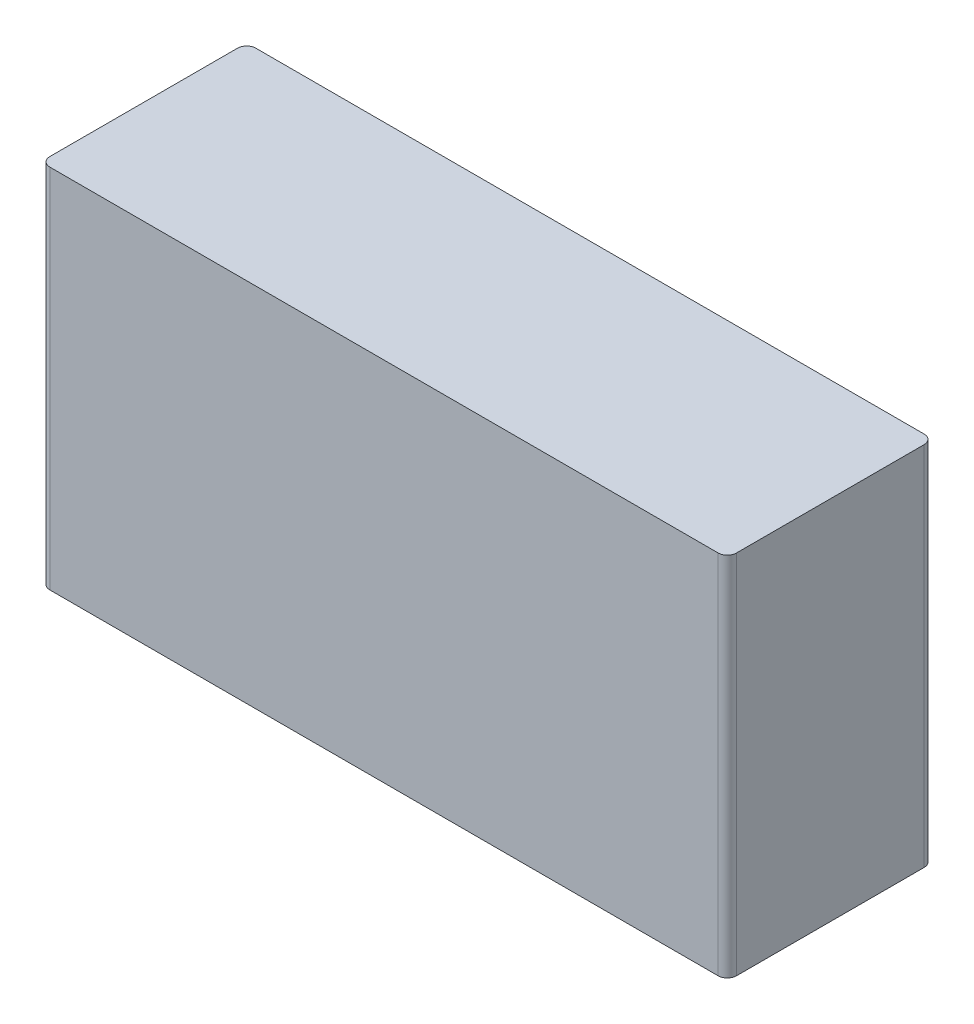
ISO-10303-21;
HEADER;
FILE_DESCRIPTION(('STEP AP214'),'2;1');
FILE_NAME('part.step','',(''),(''),'','','');
FILE_SCHEMA(('AUTOMOTIVE_DESIGN { 1 0 10303 214 1 1 1 1 }'));
ENDSEC;
DATA;
#1=APPLICATION_CONTEXT('core data for automotive mechanical design processes');
#2=APPLICATION_PROTOCOL_DEFINITION('international standard','automotive_design',2000,#1);
#3=PRODUCT_CONTEXT('',#1,'mechanical');
#4=PRODUCT('Part','Part','',(#3));
#5=PRODUCT_RELATED_PRODUCT_CATEGORY('part','',(#4));
#6=PRODUCT_DEFINITION_FORMATION('','',#4);
#7=PRODUCT_DEFINITION_CONTEXT('part definition',#1,'design');
#8=PRODUCT_DEFINITION('design','',#6,#7);
#9=PRODUCT_DEFINITION_SHAPE('','',#8);
#10=(LENGTH_UNIT() NAMED_UNIT(*) SI_UNIT(.MILLI.,.METRE.));
#11=(NAMED_UNIT(*) PLANE_ANGLE_UNIT() SI_UNIT($,.RADIAN.));
#12=(NAMED_UNIT(*) SI_UNIT($,.STERADIAN.) SOLID_ANGLE_UNIT());
#13=UNCERTAINTY_MEASURE_WITH_UNIT(LENGTH_MEASURE(1.E-05),#10,'distance_accuracy_value','');
#14=(GEOMETRIC_REPRESENTATION_CONTEXT(3) GLOBAL_UNCERTAINTY_ASSIGNED_CONTEXT((#13)) GLOBAL_UNIT_ASSIGNED_CONTEXT((#10,
#11,#12)) REPRESENTATION_CONTEXT('',''));
#15=CARTESIAN_POINT('',(0.,0.,0.));
#16=DIRECTION('',(0.,0.,1.));
#17=DIRECTION('',(1.,0.,0.));
#18=AXIS2_PLACEMENT_3D('',#15,#16,#17);
#19=CARTESIAN_POINT('',(0.,0.,0.5));
#20=DIRECTION('',(0.,0.,-1.));
#21=DIRECTION('',(0.,-1.,0.));
#22=AXIS2_PLACEMENT_3D('',#19,#20,#21);
#23=PLANE('',#22);
#24=DIRECTION('',(0.,1.,0.));
#25=VECTOR('',#24,1.);
#26=CARTESIAN_POINT('',(-0.73,0.2,0.5));
#27=LINE('',#26,#25);
#28=CARTESIAN_POINT('',(-0.73,-0.4,0.5));
#29=VERTEX_POINT('',#28);
#30=CARTESIAN_POINT('',(-0.73,0.4,0.5));
#31=VERTEX_POINT('',#30);
#32=EDGE_CURVE('E160',#29,#31,#27,.T.);
#33=ORIENTED_EDGE('',*,*,#32,.F.);
#34=DIRECTION('',(1.,0.,0.));
#35=VECTOR('',#34,1.);
#36=CARTESIAN_POINT('',(-0.775,-0.4,0.5));
#37=LINE('',#36,#35);
#38=CARTESIAN_POINT('',(0.73,-0.4,0.5));
#39=VERTEX_POINT('',#38);
#40=EDGE_CURVE('E11',#29,#39,#37,.T.);
#41=ORIENTED_EDGE('',*,*,#40,.T.);
#42=DIRECTION('',(0.,-1.,0.));
#43=VECTOR('',#42,1.);
#44=CARTESIAN_POINT('',(0.73,0.2,0.5));
#45=LINE('',#44,#43);
#46=CARTESIAN_POINT('',(0.73,0.4,0.5));
#47=VERTEX_POINT('',#46);
#48=EDGE_CURVE('E20',#47,#39,#45,.T.);
#49=ORIENTED_EDGE('',*,*,#48,.F.);
#50=DIRECTION('',(-1.,0.,0.));
#51=VECTOR('',#50,1.);
#52=CARTESIAN_POINT('',(0.025,0.4,0.5));
#53=LINE('',#52,#51);
#54=EDGE_CURVE('E176',#47,#31,#53,.T.);
#55=ORIENTED_EDGE('',*,*,#54,.T.);
#56=EDGE_LOOP('',(#33,#41,#49,#55));
#57=FACE_BOUND('',#56,.T.);
#58=ADVANCED_FACE('F17',(#57),#23,.F.);
#59=CARTESIAN_POINT('',(-0.8,-0.4,0.));
#60=DIRECTION('',(0.,-1.,0.));
#61=DIRECTION('',(0.,0.,-1.));
#62=AXIS2_PLACEMENT_3D('',#59,#60,#61);
#63=PLANE('',#62);
#64=CARTESIAN_POINT('',(-0.73,-0.4,0.48));
#65=DIRECTION('',(0.,1.,0.));
#66=DIRECTION('',(-0.707106781186548,0.,0.707106781186548));
#67=AXIS2_PLACEMENT_3D('',#64,#65,#66);
#68=CIRCLE('',#67,0.02);
#69=CARTESIAN_POINT('',(-0.75,-0.4,0.48));
#70=VERTEX_POINT('',#69);
#71=EDGE_CURVE('E164',#70,#29,#68,.T.);
#72=ORIENTED_EDGE('',*,*,#71,.F.);
#73=DIRECTION('',(0.,0.,1.));
#74=VECTOR('',#73,1.);
#75=CARTESIAN_POINT('',(-0.75,-0.4,0.025));
#76=LINE('',#75,#74);
#77=CARTESIAN_POINT('',(-0.75,-0.4,0.07));
#78=VERTEX_POINT('',#77);
#79=EDGE_CURVE('E179',#78,#70,#76,.T.);
#80=ORIENTED_EDGE('',*,*,#79,.F.);
#81=CARTESIAN_POINT('',(-0.73,-0.4,0.07));
#82=DIRECTION('',(0.,1.,0.));
#83=DIRECTION('',(-0.707106781186548,0.,-0.707106781186548));
#84=AXIS2_PLACEMENT_3D('',#81,#82,#83);
#85=CIRCLE('',#84,0.02);
#86=CARTESIAN_POINT('',(-0.73,-0.4,0.05));
#87=VERTEX_POINT('',#86);
#88=EDGE_CURVE('E108',#87,#78,#85,.T.);
#89=ORIENTED_EDGE('',*,*,#88,.F.);
#90=DIRECTION('',(-1.,0.,0.));
#91=VECTOR('',#90,1.);
#92=CARTESIAN_POINT('',(-0.025,-0.4,0.05));
#93=LINE('',#92,#91);
#94=CARTESIAN_POINT('',(0.73,-0.4,0.05));
#95=VERTEX_POINT('',#94);
#96=EDGE_CURVE('E107',#95,#87,#93,.T.);
#97=ORIENTED_EDGE('',*,*,#96,.F.);
#98=CARTESIAN_POINT('',(0.73,-0.4,0.07));
#99=DIRECTION('',(0.,1.,0.));
#100=DIRECTION('',(0.707106781186548,0.,-0.707106781186548));
#101=AXIS2_PLACEMENT_3D('',#98,#99,#100);
#102=CIRCLE('',#101,0.02);
#103=CARTESIAN_POINT('',(0.75,-0.4,0.07));
#104=VERTEX_POINT('',#103);
#105=EDGE_CURVE('E103',#104,#95,#102,.T.);
#106=ORIENTED_EDGE('',*,*,#105,.F.);
#107=DIRECTION('',(0.,0.,-1.));
#108=VECTOR('',#107,1.);
#109=CARTESIAN_POINT('',(0.75,-0.4,0.25));
#110=LINE('',#109,#108);
#111=CARTESIAN_POINT('',(0.75,-0.4,0.48));
#112=VERTEX_POINT('',#111);
#113=EDGE_CURVE('E157',#112,#104,#110,.T.);
#114=ORIENTED_EDGE('',*,*,#113,.F.);
#115=CARTESIAN_POINT('',(0.73,-0.4,0.48));
#116=DIRECTION('',(0.,1.,0.));
#117=DIRECTION('',(0.707106781186548,0.,0.707106781186548));
#118=AXIS2_PLACEMENT_3D('',#115,#116,#117);
#119=CIRCLE('',#118,0.02);
#120=EDGE_CURVE('E27',#39,#112,#119,.T.);
#121=ORIENTED_EDGE('',*,*,#120,.F.);
#122=ORIENTED_EDGE('',*,*,#40,.F.);
#123=EDGE_LOOP('',(#72,#80,#89,#97,#106,#114,#121,#122));
#124=FACE_BOUND('',#123,.T.);
#125=ADVANCED_FACE('F213',(#124),#63,.T.);
#126=CARTESIAN_POINT('',(0.73,0.2,0.48));
#127=DIRECTION('',(0.,1.,0.));
#128=DIRECTION('',(0.707106781186548,0.,0.707106781186548));
#129=AXIS2_PLACEMENT_3D('',#126,#127,#128);
#130=CYLINDRICAL_SURFACE('',#129,0.02);
#131=CARTESIAN_POINT('',(0.73,0.4,0.48));
#132=DIRECTION('',(0.,-1.,0.));
#133=DIRECTION('',(0.707106781186548,0.,0.707106781186548));
#134=AXIS2_PLACEMENT_3D('',#131,#132,#133);
#135=CIRCLE('',#134,0.02);
#136=CARTESIAN_POINT('',(0.75,0.4,0.48));
#137=VERTEX_POINT('',#136);
#138=EDGE_CURVE('E131',#137,#47,#135,.T.);
#139=ORIENTED_EDGE('',*,*,#138,.T.);
#140=ORIENTED_EDGE('',*,*,#48,.T.);
#141=ORIENTED_EDGE('',*,*,#120,.T.);
#142=DIRECTION('',(0.,1.,0.));
#143=VECTOR('',#142,1.);
#144=CARTESIAN_POINT('',(0.75,0.2,0.48));
#145=LINE('',#144,#143);
#146=EDGE_CURVE('E154',#112,#137,#145,.T.);
#147=ORIENTED_EDGE('',*,*,#146,.T.);
#148=EDGE_LOOP('',(#139,#140,#141,#147));
#149=FACE_BOUND('',#148,.T.);
#150=ADVANCED_FACE('F207',(#149),#130,.T.);
#151=CARTESIAN_POINT('',(0.75,0.4,0.5));
#152=DIRECTION('',(1.,0.,0.));
#153=DIRECTION('',(0.,0.,-1.));
#154=AXIS2_PLACEMENT_3D('',#151,#152,#153);
#155=PLANE('',#154);
#156=DIRECTION('',(0.,-1.,0.));
#157=VECTOR('',#156,1.);
#158=CARTESIAN_POINT('',(0.75,0.4,0.07));
#159=LINE('',#158,#157);
#160=CARTESIAN_POINT('',(0.75,0.4,0.07));
#161=VERTEX_POINT('',#160);
#162=EDGE_CURVE('E139',#161,#104,#159,.T.);
#163=ORIENTED_EDGE('',*,*,#162,.F.);
#164=DIRECTION('',(0.,0.,1.));
#165=VECTOR('',#164,1.);
#166=CARTESIAN_POINT('',(0.75,0.4,0.25));
#167=LINE('',#166,#165);
#168=EDGE_CURVE('E124',#161,#137,#167,.T.);
#169=ORIENTED_EDGE('',*,*,#168,.T.);
#170=ORIENTED_EDGE('',*,*,#146,.F.);
#171=ORIENTED_EDGE('',*,*,#113,.T.);
#172=EDGE_LOOP('',(#163,#169,#170,#171));
#173=FACE_BOUND('',#172,.T.);
#174=ADVANCED_FACE('F211',(#173),#155,.T.);
#175=CARTESIAN_POINT('',(0.73,0.4,0.07));
#176=DIRECTION('',(0.,1.,0.));
#177=DIRECTION('',(0.707106781186548,0.,-0.707106781186548));
#178=AXIS2_PLACEMENT_3D('',#175,#176,#177);
#179=CYLINDRICAL_SURFACE('',#178,0.02);
#180=CARTESIAN_POINT('',(0.73,0.4,0.07));
#181=DIRECTION('',(0.,-1.,0.));
#182=DIRECTION('',(0.707106781186548,0.,-0.707106781186548));
#183=AXIS2_PLACEMENT_3D('',#180,#181,#182);
#184=CIRCLE('',#183,0.02);
#185=CARTESIAN_POINT('',(0.73,0.4,0.05));
#186=VERTEX_POINT('',#185);
#187=EDGE_CURVE('E100',#186,#161,#184,.T.);
#188=ORIENTED_EDGE('',*,*,#187,.T.);
#189=ORIENTED_EDGE('',*,*,#162,.T.);
#190=ORIENTED_EDGE('',*,*,#105,.T.);
#191=DIRECTION('',(0.,1.,0.));
#192=VECTOR('',#191,1.);
#193=CARTESIAN_POINT('',(0.73,0.4,0.05));
#194=LINE('',#193,#192);
#195=EDGE_CURVE('E95',#95,#186,#194,.T.);
#196=ORIENTED_EDGE('',*,*,#195,.T.);
#197=EDGE_LOOP('',(#188,#189,#190,#196));
#198=FACE_BOUND('',#197,.T.);
#199=ADVANCED_FACE('F97',(#198),#179,.T.);
#200=CARTESIAN_POINT('',(0.75,0.4,0.05));
#201=DIRECTION('',(0.,0.,-1.));
#202=DIRECTION('',(-1.,0.,0.));
#203=AXIS2_PLACEMENT_3D('',#200,#201,#202);
#204=PLANE('',#203);
#205=DIRECTION('',(0.,-1.,0.));
#206=VECTOR('',#205,1.);
#207=CARTESIAN_POINT('',(-0.73,0.4,0.05));
#208=LINE('',#207,#206);
#209=CARTESIAN_POINT('',(-0.73,0.4,0.05));
#210=VERTEX_POINT('',#209);
#211=EDGE_CURVE('E114',#210,#87,#208,.T.);
#212=ORIENTED_EDGE('',*,*,#211,.F.);
#213=DIRECTION('',(1.,0.,0.));
#214=VECTOR('',#213,1.);
#215=CARTESIAN_POINT('',(0.775,0.4,0.05));
#216=LINE('',#215,#214);
#217=EDGE_CURVE('E111',#210,#186,#216,.T.);
#218=ORIENTED_EDGE('',*,*,#217,.T.);
#219=ORIENTED_EDGE('',*,*,#195,.F.);
#220=ORIENTED_EDGE('',*,*,#96,.T.);
#221=EDGE_LOOP('',(#212,#218,#219,#220));
#222=FACE_BOUND('',#221,.T.);
#223=ADVANCED_FACE('F112',(#222),#204,.T.);
#224=CARTESIAN_POINT('',(-0.73,0.4,0.07));
#225=DIRECTION('',(0.,1.,0.));
#226=DIRECTION('',(-0.707106781186548,0.,-0.707106781186548));
#227=AXIS2_PLACEMENT_3D('',#224,#225,#226);
#228=CYLINDRICAL_SURFACE('',#227,0.02);
#229=CARTESIAN_POINT('',(-0.73,0.4,0.07));
#230=DIRECTION('',(0.,-1.,0.));
#231=DIRECTION('',(-0.707106781186548,0.,-0.707106781186548));
#232=AXIS2_PLACEMENT_3D('',#229,#230,#231);
#233=CIRCLE('',#232,0.02);
#234=CARTESIAN_POINT('',(-0.75,0.4,0.07));
#235=VERTEX_POINT('',#234);
#236=EDGE_CURVE('E118',#235,#210,#233,.T.);
#237=ORIENTED_EDGE('',*,*,#236,.T.);
#238=ORIENTED_EDGE('',*,*,#211,.T.);
#239=ORIENTED_EDGE('',*,*,#88,.T.);
#240=DIRECTION('',(0.,1.,0.));
#241=VECTOR('',#240,1.);
#242=CARTESIAN_POINT('',(-0.75,0.4,0.07));
#243=LINE('',#242,#241);
#244=EDGE_CURVE('E185',#78,#235,#243,.T.);
#245=ORIENTED_EDGE('',*,*,#244,.T.);
#246=EDGE_LOOP('',(#237,#238,#239,#245));
#247=FACE_BOUND('',#246,.T.);
#248=ADVANCED_FACE('F251',(#247),#228,.T.);
#249=CARTESIAN_POINT('',(0.8,0.4,0.));
#250=DIRECTION('',(0.,1.,0.));
#251=DIRECTION('',(1.,0.,0.));
#252=AXIS2_PLACEMENT_3D('',#249,#250,#251);
#253=PLANE('',#252);
#254=CARTESIAN_POINT('',(-0.73,0.4,0.48));
#255=DIRECTION('',(0.,-1.,0.));
#256=DIRECTION('',(-0.707106781186548,0.,0.707106781186548));
#257=AXIS2_PLACEMENT_3D('',#254,#255,#256);
#258=CIRCLE('',#257,0.02);
#259=CARTESIAN_POINT('',(-0.75,0.4,0.48));
#260=VERTEX_POINT('',#259);
#261=EDGE_CURVE('E163',#31,#260,#258,.T.);
#262=ORIENTED_EDGE('',*,*,#261,.F.);
#263=ORIENTED_EDGE('',*,*,#54,.F.);
#264=ORIENTED_EDGE('',*,*,#138,.F.);
#265=ORIENTED_EDGE('',*,*,#168,.F.);
#266=ORIENTED_EDGE('',*,*,#187,.F.);
#267=ORIENTED_EDGE('',*,*,#217,.F.);
#268=ORIENTED_EDGE('',*,*,#236,.F.);
#269=DIRECTION('',(0.,0.,-1.));
#270=VECTOR('',#269,1.);
#271=CARTESIAN_POINT('',(-0.75,0.4,0.025));
#272=LINE('',#271,#270);
#273=EDGE_CURVE('E134',#260,#235,#272,.T.);
#274=ORIENTED_EDGE('',*,*,#273,.F.);
#275=EDGE_LOOP('',(#262,#263,#264,#265,#266,#267,#268,#274));
#276=FACE_BOUND('',#275,.T.);
#277=ADVANCED_FACE('F121',(#276),#253,.T.);
#278=CARTESIAN_POINT('',(-0.75,0.4,0.05));
#279=DIRECTION('',(-1.,0.,0.));
#280=DIRECTION('',(0.,1.,0.));
#281=AXIS2_PLACEMENT_3D('',#278,#279,#280);
#282=PLANE('',#281);
#283=DIRECTION('',(0.,-1.,0.));
#284=VECTOR('',#283,1.);
#285=CARTESIAN_POINT('',(-0.75,0.2,0.48));
#286=LINE('',#285,#284);
#287=EDGE_CURVE('E166',#260,#70,#286,.T.);
#288=ORIENTED_EDGE('',*,*,#287,.F.);
#289=ORIENTED_EDGE('',*,*,#273,.T.);
#290=ORIENTED_EDGE('',*,*,#244,.F.);
#291=ORIENTED_EDGE('',*,*,#79,.T.);
#292=EDGE_LOOP('',(#288,#289,#290,#291));
#293=FACE_BOUND('',#292,.T.);
#294=ADVANCED_FACE('F199',(#293),#282,.T.);
#295=CARTESIAN_POINT('',(-0.73,0.2,0.48));
#296=DIRECTION('',(0.,-1.,0.));
#297=DIRECTION('',(-0.707106781186548,0.,0.707106781186548));
#298=AXIS2_PLACEMENT_3D('',#295,#296,#297);
#299=CYLINDRICAL_SURFACE('',#298,0.02);
#300=ORIENTED_EDGE('',*,*,#71,.T.);
#301=ORIENTED_EDGE('',*,*,#32,.T.);
#302=ORIENTED_EDGE('',*,*,#261,.T.);
#303=ORIENTED_EDGE('',*,*,#287,.T.);
#304=EDGE_LOOP('',(#300,#301,#302,#303));
#305=FACE_BOUND('',#304,.T.);
#306=ADVANCED_FACE('F202',(#305),#299,.T.);
#307=CLOSED_SHELL('',(#58,#125,#150,#174,#199,#223,#248,#277,#294,#306));
#308=MANIFOLD_SOLID_BREP('B1',#307);
#309=ADVANCED_BREP_SHAPE_REPRESENTATION('',(#18,#308),#14);
#310=SHAPE_DEFINITION_REPRESENTATION(#9,#309);
ENDSEC;
END-ISO-10303-21;
